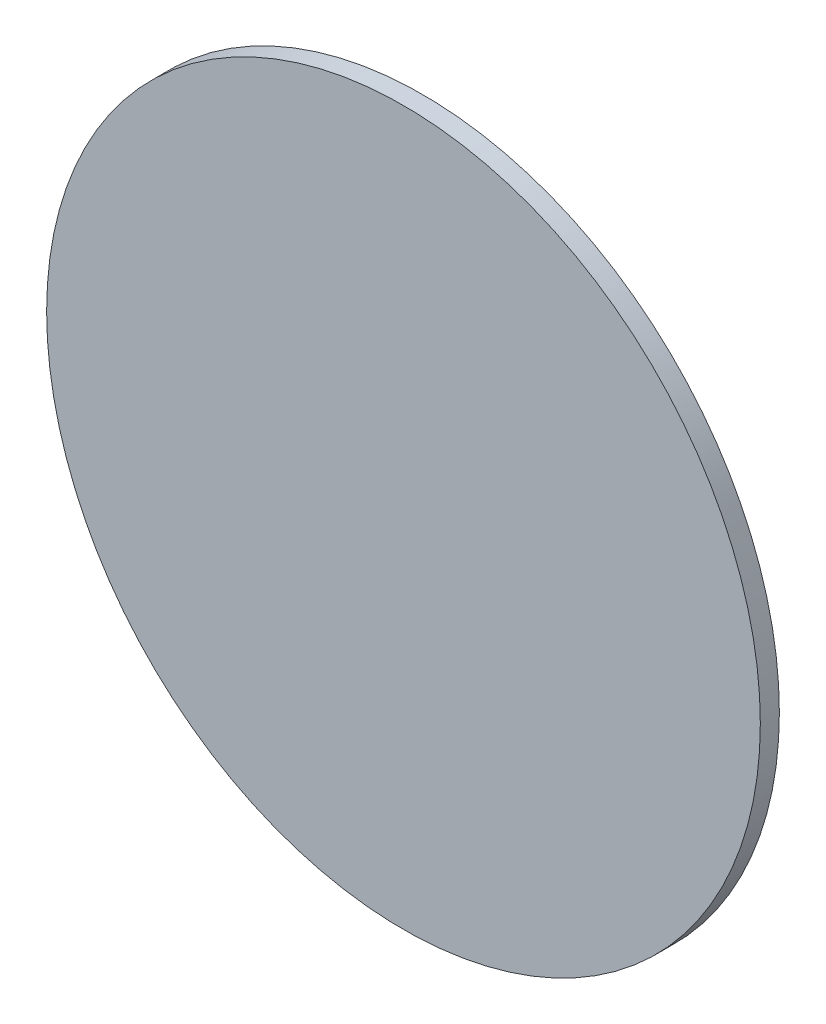
ISO-10303-21;
HEADER;
FILE_DESCRIPTION(('STEP AP214'),'2;1');
FILE_NAME('part.step','',(''),(''),'','','');
FILE_SCHEMA(('AUTOMOTIVE_DESIGN { 1 0 10303 214 1 1 1 1 }'));
ENDSEC;
DATA;
#1=APPLICATION_CONTEXT('core data for automotive mechanical design processes');
#2=APPLICATION_PROTOCOL_DEFINITION('international standard','automotive_design',2000,#1);
#3=PRODUCT_CONTEXT('',#1,'mechanical');
#4=PRODUCT('Part','Part','',(#3));
#5=PRODUCT_RELATED_PRODUCT_CATEGORY('part','',(#4));
#6=PRODUCT_DEFINITION_FORMATION('','',#4);
#7=PRODUCT_DEFINITION_CONTEXT('part definition',#1,'design');
#8=PRODUCT_DEFINITION('design','',#6,#7);
#9=PRODUCT_DEFINITION_SHAPE('','',#8);
#10=(LENGTH_UNIT() NAMED_UNIT(*) SI_UNIT(.MILLI.,.METRE.));
#11=(NAMED_UNIT(*) PLANE_ANGLE_UNIT() SI_UNIT($,.RADIAN.));
#12=(NAMED_UNIT(*) SI_UNIT($,.STERADIAN.) SOLID_ANGLE_UNIT());
#13=UNCERTAINTY_MEASURE_WITH_UNIT(LENGTH_MEASURE(1.E-05),#10,'distance_accuracy_value','');
#14=(GEOMETRIC_REPRESENTATION_CONTEXT(3) GLOBAL_UNCERTAINTY_ASSIGNED_CONTEXT((#13)) GLOBAL_UNIT_ASSIGNED_CONTEXT((#10,
#11,#12)) REPRESENTATION_CONTEXT('',''));
#15=CARTESIAN_POINT('',(0.,0.,0.));
#16=DIRECTION('',(0.,0.,1.));
#17=DIRECTION('',(1.,0.,0.));
#18=AXIS2_PLACEMENT_3D('',#15,#16,#17);
#19=CARTESIAN_POINT('',(-34.8287697989362,5.49927944193729,1.2));
#20=DIRECTION('',(0.,0.,-1.));
#21=DIRECTION('',(-1.,0.,0.));
#22=AXIS2_PLACEMENT_3D('',#19,#20,#21);
#23=CYLINDRICAL_SURFACE('',#22,22.5);
#24=CARTESIAN_POINT('',(-34.8287697989362,5.49927944193729,1.2));
#25=DIRECTION('',(0.,0.,1.));
#26=DIRECTION('',(1.,0.,0.));
#27=AXIS2_PLACEMENT_3D('',#24,#25,#26);
#28=CIRCLE('',#27,22.5);
#29=CARTESIAN_POINT('',(-12.3287697989362,5.49927944193729,1.2));
#30=VERTEX_POINT('',#29);
#31=EDGE_CURVE('E10',#30,#30,#28,.T.);
#32=ORIENTED_EDGE('',*,*,#31,.F.);
#33=EDGE_LOOP('',(#32));
#34=FACE_BOUND('',#33,.T.);
#35=CARTESIAN_POINT('',(-34.8287697989362,5.49927944193729,0.));
#36=DIRECTION('',(0.,0.,1.));
#37=DIRECTION('',(1.,0.,0.));
#38=AXIS2_PLACEMENT_3D('',#35,#36,#37);
#39=CIRCLE('',#38,22.5);
#40=CARTESIAN_POINT('',(-12.3287697989362,5.49927944193729,0.));
#41=VERTEX_POINT('',#40);
#42=EDGE_CURVE('E34',#41,#41,#39,.T.);
#43=ORIENTED_EDGE('',*,*,#42,.T.);
#44=EDGE_LOOP('',(#43));
#45=FACE_BOUND('',#44,.T.);
#46=ADVANCED_FACE('F31',(#34,#45),#23,.T.);
#47=CARTESIAN_POINT('',(-34.8287697989362,5.49927944193729,1.2));
#48=DIRECTION('',(0.,0.,1.));
#49=DIRECTION('',(1.,0.,0.));
#50=AXIS2_PLACEMENT_3D('',#47,#48,#49);
#51=PLANE('',#50);
#52=ORIENTED_EDGE('',*,*,#31,.T.);
#53=EDGE_LOOP('',(#52));
#54=FACE_BOUND('',#53,.T.);
#55=ADVANCED_FACE('F46',(#54),#51,.T.);
#56=CARTESIAN_POINT('',(-34.8287697989362,5.49927944193729,0.));
#57=DIRECTION('',(0.,0.,1.));
#58=DIRECTION('',(1.,0.,0.));
#59=AXIS2_PLACEMENT_3D('',#56,#57,#58);
#60=PLANE('',#59);
#61=ORIENTED_EDGE('',*,*,#42,.F.);
#62=EDGE_LOOP('',(#61));
#63=FACE_BOUND('',#62,.T.);
#64=ADVANCED_FACE('F44',(#63),#60,.F.);
#65=CLOSED_SHELL('',(#46,#55,#64));
#66=MANIFOLD_SOLID_BREP('B2',#65);
#67=ADVANCED_BREP_SHAPE_REPRESENTATION('',(#18,#66),#14);
#68=SHAPE_DEFINITION_REPRESENTATION(#9,#67);
ENDSEC;
END-ISO-10303-21;
